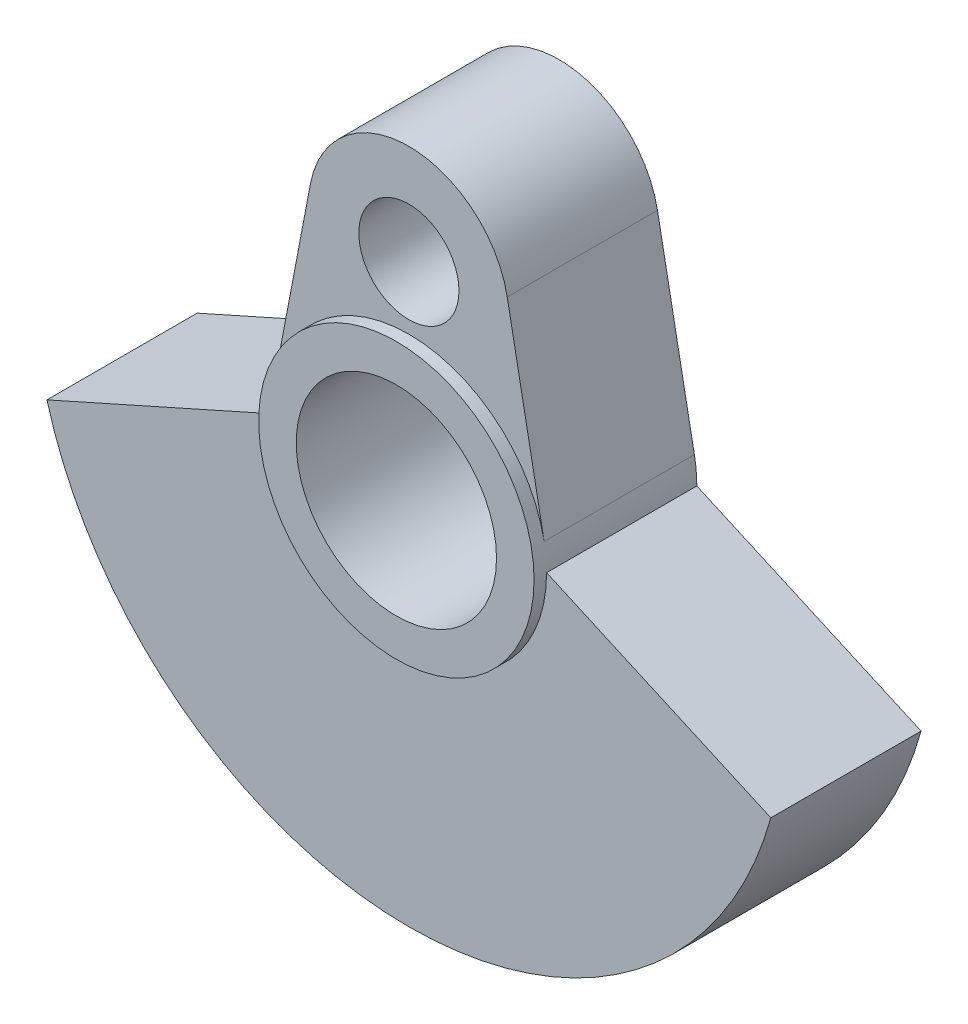
ISO-10303-21;
HEADER;
FILE_DESCRIPTION(('STEP AP214'),'2;1');
FILE_NAME('part.step','',(''),(''),'','','');
FILE_SCHEMA(('AUTOMOTIVE_DESIGN { 1 0 10303 214 1 1 1 1 }'));
ENDSEC;
DATA;
#1=APPLICATION_CONTEXT('core data for automotive mechanical design processes');
#2=APPLICATION_PROTOCOL_DEFINITION('international standard','automotive_design',2000,#1);
#3=PRODUCT_CONTEXT('',#1,'mechanical');
#4=PRODUCT('Part','Part','',(#3));
#5=PRODUCT_RELATED_PRODUCT_CATEGORY('part','',(#4));
#6=PRODUCT_DEFINITION_FORMATION('','',#4);
#7=PRODUCT_DEFINITION_CONTEXT('part definition',#1,'design');
#8=PRODUCT_DEFINITION('design','',#6,#7);
#9=PRODUCT_DEFINITION_SHAPE('','',#8);
#10=(LENGTH_UNIT() NAMED_UNIT(*) SI_UNIT(.MILLI.,.METRE.));
#11=(NAMED_UNIT(*) PLANE_ANGLE_UNIT() SI_UNIT($,.RADIAN.));
#12=(NAMED_UNIT(*) SI_UNIT($,.STERADIAN.) SOLID_ANGLE_UNIT());
#13=UNCERTAINTY_MEASURE_WITH_UNIT(LENGTH_MEASURE(1.E-05),#10,'distance_accuracy_value','');
#14=(GEOMETRIC_REPRESENTATION_CONTEXT(3) GLOBAL_UNCERTAINTY_ASSIGNED_CONTEXT((#13)) GLOBAL_UNIT_ASSIGNED_CONTEXT((#10,
#11,#12)) REPRESENTATION_CONTEXT('',''));
#15=CARTESIAN_POINT('',(0.,0.,0.));
#16=DIRECTION('',(0.,0.,1.));
#17=DIRECTION('',(1.,0.,0.));
#18=AXIS2_PLACEMENT_3D('',#15,#16,#17);
#19=CARTESIAN_POINT('',(0.,0.,3.5));
#20=DIRECTION('',(0.,0.,-1.));
#21=DIRECTION('',(-1.,0.,0.));
#22=AXIS2_PLACEMENT_3D('',#19,#20,#21);
#23=CYLINDRICAL_SURFACE('',#22,5.5);
#24=CARTESIAN_POINT('',(0.,0.,3.5));
#25=DIRECTION('',(0.,0.,1.));
#26=DIRECTION('',(1.,0.,0.));
#27=AXIS2_PLACEMENT_3D('',#24,#25,#26);
#28=CIRCLE('',#27,5.5);
#29=CARTESIAN_POINT('',(5.5,0.,3.5));
#30=VERTEX_POINT('',#29);
#31=EDGE_CURVE('E145',#30,#30,#28,.T.);
#32=ORIENTED_EDGE('',*,*,#31,.F.);
#33=EDGE_LOOP('',(#32));
#34=FACE_BOUND('',#33,.T.);
#35=DIRECTION('',(0.,0.,-1.));
#36=VECTOR('',#35,1.);
#37=CARTESIAN_POINT('',(5.40245531564121,1.03125,3.));
#38=LINE('',#37,#36);
#39=CARTESIAN_POINT('',(5.40245531564122,1.03125,3.));
#40=VERTEX_POINT('',#39);
#41=CARTESIAN_POINT('',(5.40245531564121,1.03125,-3.));
#42=VERTEX_POINT('',#41);
#43=EDGE_CURVE('E59',#40,#42,#38,.T.);
#44=ORIENTED_EDGE('',*,*,#43,.F.);
#45=CARTESIAN_POINT('',(0.,0.,3.));
#46=DIRECTION('',(0.,0.,1.));
#47=DIRECTION('',(1.,0.,0.));
#48=AXIS2_PLACEMENT_3D('',#45,#46,#47);
#49=CIRCLE('',#48,5.5);
#50=CARTESIAN_POINT('',(-5.40245531564122,1.03125,3.));
#51=VERTEX_POINT('',#50);
#52=EDGE_CURVE('E178',#40,#51,#49,.T.);
#53=ORIENTED_EDGE('',*,*,#52,.T.);
#54=DIRECTION('',(0.,0.,-1.));
#55=VECTOR('',#54,1.);
#56=CARTESIAN_POINT('',(-5.40245531564121,1.03125,3.));
#57=LINE('',#56,#55);
#58=CARTESIAN_POINT('',(-5.40245531564121,1.03125,-3.));
#59=VERTEX_POINT('',#58);
#60=EDGE_CURVE('E52',#51,#59,#57,.T.);
#61=ORIENTED_EDGE('',*,*,#60,.T.);
#62=CARTESIAN_POINT('',(0.,0.,-3.));
#63=DIRECTION('',(0.,0.,1.));
#64=DIRECTION('',(1.,0.,0.));
#65=AXIS2_PLACEMENT_3D('',#62,#63,#64);
#66=CIRCLE('',#65,5.5);
#67=CARTESIAN_POINT('',(-5.5,0.,-3.));
#68=VERTEX_POINT('',#67);
#69=EDGE_CURVE('E123',#68,#59,#66,.F.);
#70=ORIENTED_EDGE('',*,*,#69,.F.);
#71=DIRECTION('',(0.,0.,-1.));
#72=VECTOR('',#71,1.);
#73=CARTESIAN_POINT('',(-5.5,0.,3.));
#74=LINE('',#73,#72);
#75=CARTESIAN_POINT('',(-5.5,0.,3.));
#76=VERTEX_POINT('',#75);
#77=EDGE_CURVE('E111',#76,#68,#74,.T.);
#78=ORIENTED_EDGE('',*,*,#77,.F.);
#79=CARTESIAN_POINT('',(0.,0.,3.));
#80=DIRECTION('',(0.,0.,1.));
#81=DIRECTION('',(1.,0.,0.));
#82=AXIS2_PLACEMENT_3D('',#79,#80,#81);
#83=CIRCLE('',#82,5.5);
#84=CARTESIAN_POINT('',(5.5,0.,3.));
#85=VERTEX_POINT('',#84);
#86=EDGE_CURVE('E106',#76,#85,#83,.T.);
#87=ORIENTED_EDGE('',*,*,#86,.T.);
#88=DIRECTION('',(0.,0.,-1.));
#89=VECTOR('',#88,1.);
#90=CARTESIAN_POINT('',(5.5,0.,3.));
#91=LINE('',#90,#89);
#92=CARTESIAN_POINT('',(5.5,0.,-3.));
#93=VERTEX_POINT('',#92);
#94=EDGE_CURVE('E100',#85,#93,#91,.T.);
#95=ORIENTED_EDGE('',*,*,#94,.T.);
#96=EDGE_CURVE('E102',#42,#93,#66,.F.);
#97=ORIENTED_EDGE('',*,*,#96,.F.);
#98=EDGE_LOOP('',(#44,#53,#61,#70,#78,#87,#95,#97));
#99=FACE_BOUND('',#98,.T.);
#100=ADVANCED_FACE('F37',(#34,#99),#23,.T.);
#101=CARTESIAN_POINT('',(-0.914524728224361,2.04781115503851,3.));
#102=DIRECTION('',(-0.407771042759929,0.9130842111692,0.));
#103=DIRECTION('',(-0.9130842111692,-0.407771042759929,0.));
#104=AXIS2_PLACEMENT_3D('',#101,#102,#103);
#105=PLANE('',#104);
#106=DIRECTION('',(0.9130842111692,0.407771042759929,0.));
#107=VECTOR('',#106,1.);
#108=CARTESIAN_POINT('',(-0.914524728224361,2.04781115503851,-3.));
#109=LINE('',#108,#107);
#110=CARTESIAN_POINT('',(-14.456832294801,-4.,-3.));
#111=VERTEX_POINT('',#110);
#112=EDGE_CURVE('E134',#111,#68,#109,.T.);
#113=ORIENTED_EDGE('',*,*,#112,.F.);
#114=DIRECTION('',(0.,0.,-1.));
#115=VECTOR('',#114,1.);
#116=CARTESIAN_POINT('',(-14.456832294801,-4.,3.));
#117=LINE('',#116,#115);
#118=CARTESIAN_POINT('',(-14.456832294801,-4.,3.));
#119=VERTEX_POINT('',#118);
#120=EDGE_CURVE('E11',#119,#111,#117,.T.);
#121=ORIENTED_EDGE('',*,*,#120,.F.);
#122=DIRECTION('',(0.9130842111692,0.407771042759929,0.));
#123=VECTOR('',#122,1.);
#124=CARTESIAN_POINT('',(-0.914524728224361,2.04781115503851,3.));
#125=LINE('',#124,#123);
#126=EDGE_CURVE('E129',#119,#76,#125,.T.);
#127=ORIENTED_EDGE('',*,*,#126,.T.);
#128=ORIENTED_EDGE('',*,*,#77,.T.);
#129=EDGE_LOOP('',(#113,#121,#127,#128));
#130=FACE_BOUND('',#129,.T.);
#131=ADVANCED_FACE('F39',(#130),#105,.T.);
#132=CARTESIAN_POINT('',(0.,0.,3.));
#133=DIRECTION('',(0.,0.,-1.));
#134=DIRECTION('',(-1.,0.,0.));
#135=AXIS2_PLACEMENT_3D('',#132,#133,#134);
#136=CYLINDRICAL_SURFACE('',#135,15.);
#137=CARTESIAN_POINT('',(0.,0.,-3.));
#138=DIRECTION('',(0.,0.,1.));
#139=DIRECTION('',(1.,0.,0.));
#140=AXIS2_PLACEMENT_3D('',#137,#138,#139);
#141=CIRCLE('',#140,15.);
#142=CARTESIAN_POINT('',(14.456832294801,-4.,-3.));
#143=VERTEX_POINT('',#142);
#144=EDGE_CURVE('E130',#111,#143,#141,.T.);
#145=ORIENTED_EDGE('',*,*,#144,.T.);
#146=DIRECTION('',(0.,0.,-1.));
#147=VECTOR('',#146,1.);
#148=CARTESIAN_POINT('',(14.456832294801,-4.,3.));
#149=LINE('',#148,#147);
#150=CARTESIAN_POINT('',(14.456832294801,-4.,3.));
#151=VERTEX_POINT('',#150);
#152=EDGE_CURVE('E45',#151,#143,#149,.T.);
#153=ORIENTED_EDGE('',*,*,#152,.F.);
#154=CARTESIAN_POINT('',(0.,0.,3.));
#155=DIRECTION('',(0.,0.,1.));
#156=DIRECTION('',(1.,0.,0.));
#157=AXIS2_PLACEMENT_3D('',#154,#155,#156);
#158=CIRCLE('',#157,15.);
#159=EDGE_CURVE('E132',#119,#151,#158,.T.);
#160=ORIENTED_EDGE('',*,*,#159,.F.);
#161=ORIENTED_EDGE('',*,*,#120,.T.);
#162=EDGE_LOOP('',(#145,#153,#160,#161));
#163=FACE_BOUND('',#162,.T.);
#164=ADVANCED_FACE('F160',(#163),#136,.T.);
#165=CARTESIAN_POINT('',(0.914524728224361,2.04781115503851,3.));
#166=DIRECTION('',(-0.407771042759929,-0.9130842111692,0.));
#167=DIRECTION('',(0.9130842111692,-0.407771042759929,0.));
#168=AXIS2_PLACEMENT_3D('',#165,#166,#167);
#169=PLANE('',#168);
#170=DIRECTION('',(-0.9130842111692,0.407771042759929,0.));
#171=VECTOR('',#170,1.);
#172=CARTESIAN_POINT('',(0.914524728224361,2.04781115503851,-3.));
#173=LINE('',#172,#171);
#174=EDGE_CURVE('E119',#143,#93,#173,.T.);
#175=ORIENTED_EDGE('',*,*,#174,.T.);
#176=ORIENTED_EDGE('',*,*,#94,.F.);
#177=DIRECTION('',(-0.9130842111692,0.407771042759929,0.));
#178=VECTOR('',#177,1.);
#179=CARTESIAN_POINT('',(0.914524728224361,2.04781115503851,3.));
#180=LINE('',#179,#178);
#181=EDGE_CURVE('E141',#151,#85,#180,.T.);
#182=ORIENTED_EDGE('',*,*,#181,.F.);
#183=ORIENTED_EDGE('',*,*,#152,.T.);
#184=EDGE_LOOP('',(#175,#176,#182,#183));
#185=FACE_BOUND('',#184,.T.);
#186=ADVANCED_FACE('F127',(#185),#169,.F.);
#187=CARTESIAN_POINT('',(0.,0.,3.));
#188=DIRECTION('',(0.,0.,1.));
#189=DIRECTION('',(1.,0.,0.));
#190=AXIS2_PLACEMENT_3D('',#187,#188,#189);
#191=PLANE('',#190);
#192=ORIENTED_EDGE('',*,*,#126,.F.);
#193=ORIENTED_EDGE('',*,*,#159,.T.);
#194=ORIENTED_EDGE('',*,*,#181,.T.);
#195=ORIENTED_EDGE('',*,*,#86,.F.);
#196=EDGE_LOOP('',(#192,#193,#194,#195));
#197=FACE_BOUND('',#196,.T.);
#198=ADVANCED_FACE('F158',(#197),#191,.T.);
#199=CARTESIAN_POINT('',(0.,0.,-3.));
#200=DIRECTION('',(0.,0.,1.));
#201=DIRECTION('',(1.,0.,0.));
#202=AXIS2_PLACEMENT_3D('',#199,#200,#201);
#203=PLANE('',#202);
#204=ORIENTED_EDGE('',*,*,#112,.T.);
#205=ORIENTED_EDGE('',*,*,#69,.T.);
#206=DIRECTION('',(-0.1875,-0.982264602843857,0.));
#207=VECTOR('',#206,1.);
#208=CARTESIAN_POINT('',(-5.40245531564121,1.03125,-3.));
#209=LINE('',#208,#207);
#210=CARTESIAN_POINT('',(-3.92905841137543,8.75,-3.));
#211=VERTEX_POINT('',#210);
#212=EDGE_CURVE('E170',#211,#59,#209,.T.);
#213=ORIENTED_EDGE('',*,*,#212,.F.);
#214=CARTESIAN_POINT('',(0.,8.,-3.));
#215=DIRECTION('',(0.,0.,1.));
#216=DIRECTION('',(1.,0.,0.));
#217=AXIS2_PLACEMENT_3D('',#214,#215,#216);
#218=CIRCLE('',#217,4.);
#219=CARTESIAN_POINT('',(3.92905841137543,8.75,-3.));
#220=VERTEX_POINT('',#219);
#221=EDGE_CURVE('E181',#220,#211,#218,.T.);
#222=ORIENTED_EDGE('',*,*,#221,.F.);
#223=DIRECTION('',(0.1875,-0.982264602843857,0.));
#224=VECTOR('',#223,1.);
#225=CARTESIAN_POINT('',(5.40245531564121,1.03125,-3.));
#226=LINE('',#225,#224);
#227=EDGE_CURVE('E122',#220,#42,#226,.T.);
#228=ORIENTED_EDGE('',*,*,#227,.T.);
#229=ORIENTED_EDGE('',*,*,#96,.T.);
#230=ORIENTED_EDGE('',*,*,#174,.F.);
#231=ORIENTED_EDGE('',*,*,#144,.F.);
#232=EDGE_LOOP('',(#204,#205,#213,#222,#228,#229,#230,#231));
#233=FACE_BOUND('',#232,.T.);
#234=CARTESIAN_POINT('',(0.,8.,-3.));
#235=DIRECTION('',(0.,0.,1.));
#236=DIRECTION('',(1.,0.,0.));
#237=AXIS2_PLACEMENT_3D('',#234,#235,#236);
#238=CIRCLE('',#237,2.);
#239=CARTESIAN_POINT('',(2.,8.,-3.));
#240=VERTEX_POINT('',#239);
#241=EDGE_CURVE('E161',#240,#240,#238,.T.);
#242=ORIENTED_EDGE('',*,*,#241,.T.);
#243=EDGE_LOOP('',(#242));
#244=FACE_BOUND('',#243,.T.);
#245=CARTESIAN_POINT('',(0.,0.,-3.));
#246=DIRECTION('',(0.,0.,1.));
#247=DIRECTION('',(1.,0.,0.));
#248=AXIS2_PLACEMENT_3D('',#245,#246,#247);
#249=CIRCLE('',#248,4.);
#250=CARTESIAN_POINT('',(4.,0.,-3.));
#251=VERTEX_POINT('',#250);
#252=EDGE_CURVE('E124',#251,#251,#249,.F.);
#253=ORIENTED_EDGE('',*,*,#252,.F.);
#254=EDGE_LOOP('',(#253));
#255=FACE_BOUND('',#254,.T.);
#256=ADVANCED_FACE('F116',(#233,#244,#255),#203,.F.);
#257=CARTESIAN_POINT('',(0.,0.,3.5));
#258=DIRECTION('',(0.,0.,-1.));
#259=DIRECTION('',(-1.,0.,0.));
#260=AXIS2_PLACEMENT_3D('',#257,#258,#259);
#261=CYLINDRICAL_SURFACE('',#260,4.);
#262=CARTESIAN_POINT('',(0.,0.,3.5));
#263=DIRECTION('',(0.,0.,1.));
#264=DIRECTION('',(1.,0.,0.));
#265=AXIS2_PLACEMENT_3D('',#262,#263,#264);
#266=CIRCLE('',#265,4.);
#267=CARTESIAN_POINT('',(4.,0.,3.5));
#268=VERTEX_POINT('',#267);
#269=EDGE_CURVE('E147',#268,#268,#266,.T.);
#270=ORIENTED_EDGE('',*,*,#269,.T.);
#271=EDGE_LOOP('',(#270));
#272=FACE_BOUND('',#271,.T.);
#273=ORIENTED_EDGE('',*,*,#252,.T.);
#274=EDGE_LOOP('',(#273));
#275=FACE_BOUND('',#274,.T.);
#276=ADVANCED_FACE('F220',(#272,#275),#261,.F.);
#277=CARTESIAN_POINT('',(0.,0.,3.5));
#278=DIRECTION('',(0.,0.,1.));
#279=DIRECTION('',(1.,0.,0.));
#280=AXIS2_PLACEMENT_3D('',#277,#278,#279);
#281=PLANE('',#280);
#282=ORIENTED_EDGE('',*,*,#269,.F.);
#283=EDGE_LOOP('',(#282));
#284=FACE_BOUND('',#283,.T.);
#285=ORIENTED_EDGE('',*,*,#31,.T.);
#286=EDGE_LOOP('',(#285));
#287=FACE_BOUND('',#286,.T.);
#288=ADVANCED_FACE('F219',(#284,#287),#281,.T.);
#289=CARTESIAN_POINT('',(5.40245531564121,1.03125,3.));
#290=DIRECTION('',(0.982264602843857,0.187499999999999,0.));
#291=DIRECTION('',(-0.1875,0.982264602843857,0.));
#292=AXIS2_PLACEMENT_3D('',#289,#290,#291);
#293=PLANE('',#292);
#294=ORIENTED_EDGE('',*,*,#227,.F.);
#295=DIRECTION('',(0.,0.,-1.));
#296=VECTOR('',#295,1.);
#297=CARTESIAN_POINT('',(3.92905841137543,8.75,3.));
#298=LINE('',#297,#296);
#299=CARTESIAN_POINT('',(3.92905841137543,8.75,3.));
#300=VERTEX_POINT('',#299);
#301=EDGE_CURVE('E152',#300,#220,#298,.T.);
#302=ORIENTED_EDGE('',*,*,#301,.F.);
#303=DIRECTION('',(0.1875,-0.982264602843857,0.));
#304=VECTOR('',#303,1.);
#305=CARTESIAN_POINT('',(5.40245531564121,1.03125,3.));
#306=LINE('',#305,#304);
#307=EDGE_CURVE('E169',#300,#40,#306,.T.);
#308=ORIENTED_EDGE('',*,*,#307,.T.);
#309=ORIENTED_EDGE('',*,*,#43,.T.);
#310=EDGE_LOOP('',(#294,#302,#308,#309));
#311=FACE_BOUND('',#310,.T.);
#312=ADVANCED_FACE('F195',(#311),#293,.T.);
#313=CARTESIAN_POINT('',(0.,8.,3.));
#314=DIRECTION('',(0.,0.,-1.));
#315=DIRECTION('',(-1.,0.,0.));
#316=AXIS2_PLACEMENT_3D('',#313,#314,#315);
#317=CYLINDRICAL_SURFACE('',#316,4.);
#318=ORIENTED_EDGE('',*,*,#221,.T.);
#319=DIRECTION('',(0.,0.,-1.));
#320=VECTOR('',#319,1.);
#321=CARTESIAN_POINT('',(-3.92905841137543,8.75,3.));
#322=LINE('',#321,#320);
#323=CARTESIAN_POINT('',(-3.92905841137543,8.75,3.));
#324=VERTEX_POINT('',#323);
#325=EDGE_CURVE('E187',#324,#211,#322,.T.);
#326=ORIENTED_EDGE('',*,*,#325,.F.);
#327=CARTESIAN_POINT('',(0.,8.,3.));
#328=DIRECTION('',(0.,0.,1.));
#329=DIRECTION('',(1.,0.,0.));
#330=AXIS2_PLACEMENT_3D('',#327,#328,#329);
#331=CIRCLE('',#330,4.);
#332=EDGE_CURVE('E172',#300,#324,#331,.T.);
#333=ORIENTED_EDGE('',*,*,#332,.F.);
#334=ORIENTED_EDGE('',*,*,#301,.T.);
#335=EDGE_LOOP('',(#318,#326,#333,#334));
#336=FACE_BOUND('',#335,.T.);
#337=ADVANCED_FACE('F191',(#336),#317,.T.);
#338=CARTESIAN_POINT('',(-5.40245531564121,1.03125,3.));
#339=DIRECTION('',(0.982264602843857,-0.187499999999999,0.));
#340=DIRECTION('',(0.1875,0.982264602843857,0.));
#341=AXIS2_PLACEMENT_3D('',#338,#339,#340);
#342=PLANE('',#341);
#343=ORIENTED_EDGE('',*,*,#212,.T.);
#344=ORIENTED_EDGE('',*,*,#60,.F.);
#345=DIRECTION('',(-0.1875,-0.982264602843857,0.));
#346=VECTOR('',#345,1.);
#347=CARTESIAN_POINT('',(-5.40245531564121,1.03125,3.));
#348=LINE('',#347,#346);
#349=EDGE_CURVE('E175',#324,#51,#348,.T.);
#350=ORIENTED_EDGE('',*,*,#349,.F.);
#351=ORIENTED_EDGE('',*,*,#325,.T.);
#352=EDGE_LOOP('',(#343,#344,#350,#351));
#353=FACE_BOUND('',#352,.T.);
#354=ADVANCED_FACE('F199',(#353),#342,.F.);
#355=CARTESIAN_POINT('',(0.,8.,3.));
#356=DIRECTION('',(0.,0.,-1.));
#357=DIRECTION('',(-1.,0.,0.));
#358=AXIS2_PLACEMENT_3D('',#355,#356,#357);
#359=CYLINDRICAL_SURFACE('',#358,2.);
#360=CARTESIAN_POINT('',(0.,8.,3.));
#361=DIRECTION('',(0.,0.,1.));
#362=DIRECTION('',(1.,0.,0.));
#363=AXIS2_PLACEMENT_3D('',#360,#361,#362);
#364=CIRCLE('',#363,2.);
#365=CARTESIAN_POINT('',(2.,8.,3.));
#366=VERTEX_POINT('',#365);
#367=EDGE_CURVE('E166',#366,#366,#364,.T.);
#368=ORIENTED_EDGE('',*,*,#367,.T.);
#369=EDGE_LOOP('',(#368));
#370=FACE_BOUND('',#369,.T.);
#371=ORIENTED_EDGE('',*,*,#241,.F.);
#372=EDGE_LOOP('',(#371));
#373=FACE_BOUND('',#372,.T.);
#374=ADVANCED_FACE('F201',(#370,#373),#359,.F.);
#375=CARTESIAN_POINT('',(0.,0.,3.));
#376=DIRECTION('',(0.,0.,1.));
#377=DIRECTION('',(1.,0.,0.));
#378=AXIS2_PLACEMENT_3D('',#375,#376,#377);
#379=PLANE('',#378);
#380=ORIENTED_EDGE('',*,*,#367,.F.);
#381=EDGE_LOOP('',(#380));
#382=FACE_BOUND('',#381,.T.);
#383=ORIENTED_EDGE('',*,*,#307,.F.);
#384=ORIENTED_EDGE('',*,*,#332,.T.);
#385=ORIENTED_EDGE('',*,*,#349,.T.);
#386=ORIENTED_EDGE('',*,*,#52,.F.);
#387=EDGE_LOOP('',(#383,#384,#385,#386));
#388=FACE_BOUND('',#387,.T.);
#389=ADVANCED_FACE('F198',(#382,#388),#379,.T.);
#390=CLOSED_SHELL('',(#100,#131,#164,#186,#198,#256,#276,#288,#312,#337,#354,#374,#389));
#391=MANIFOLD_SOLID_BREP('B2',#390);
#392=ADVANCED_BREP_SHAPE_REPRESENTATION('',(#18,#391),#14);
#393=SHAPE_DEFINITION_REPRESENTATION(#9,#392);
ENDSEC;
END-ISO-10303-21;
